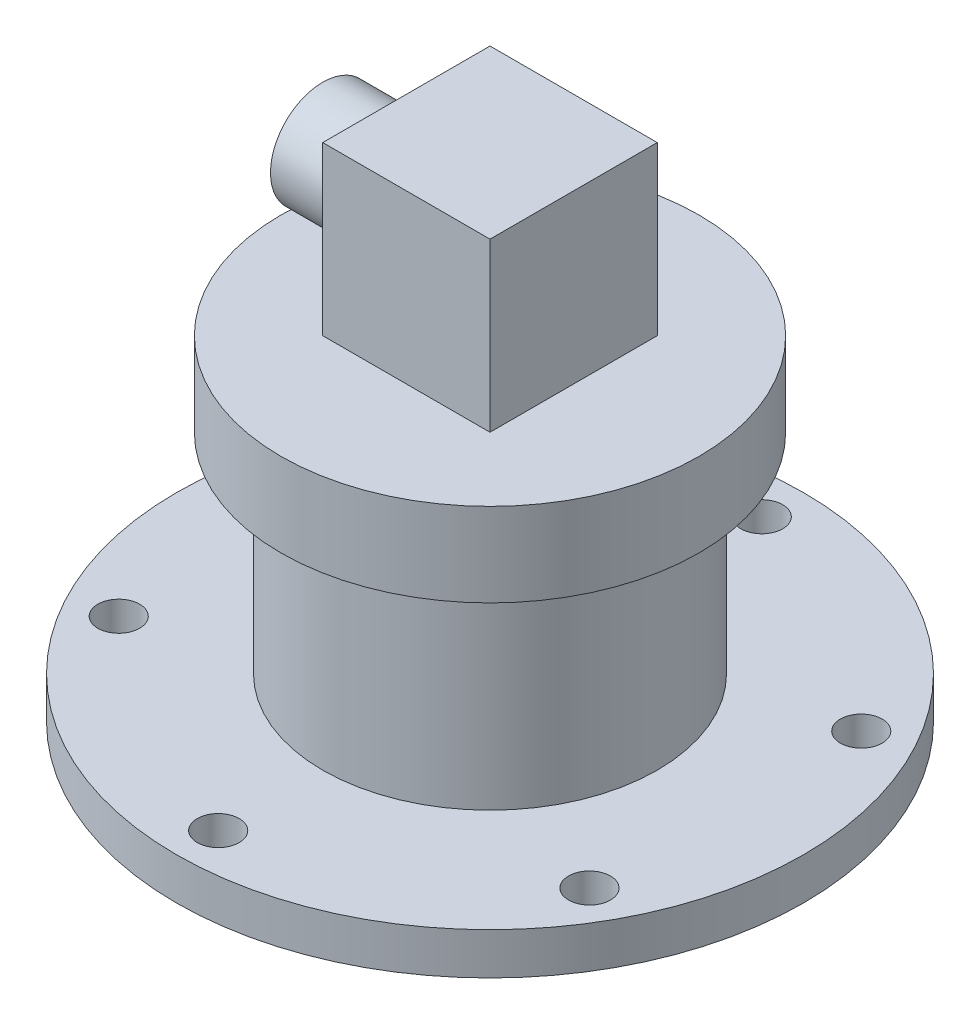
ISO-10303-21;
HEADER;
FILE_DESCRIPTION(('STEP AP214'),'2;1');
FILE_NAME('part.step','',(''),(''),'','','');
FILE_SCHEMA(('AUTOMOTIVE_DESIGN { 1 0 10303 214 1 1 1 1 }'));
ENDSEC;
DATA;
#1=APPLICATION_CONTEXT('core data for automotive mechanical design processes');
#2=APPLICATION_PROTOCOL_DEFINITION('international standard','automotive_design',2000,#1);
#3=PRODUCT_CONTEXT('',#1,'mechanical');
#4=PRODUCT('Part','Part','',(#3));
#5=PRODUCT_RELATED_PRODUCT_CATEGORY('part','',(#4));
#6=PRODUCT_DEFINITION_FORMATION('','',#4);
#7=PRODUCT_DEFINITION_CONTEXT('part definition',#1,'design');
#8=PRODUCT_DEFINITION('design','',#6,#7);
#9=PRODUCT_DEFINITION_SHAPE('','',#8);
#10=(LENGTH_UNIT() NAMED_UNIT(*) SI_UNIT(.MILLI.,.METRE.));
#11=(NAMED_UNIT(*) PLANE_ANGLE_UNIT() SI_UNIT($,.RADIAN.));
#12=(NAMED_UNIT(*) SI_UNIT($,.STERADIAN.) SOLID_ANGLE_UNIT());
#13=UNCERTAINTY_MEASURE_WITH_UNIT(LENGTH_MEASURE(1.E-05),#10,'distance_accuracy_value','');
#14=(GEOMETRIC_REPRESENTATION_CONTEXT(3) GLOBAL_UNCERTAINTY_ASSIGNED_CONTEXT((#13)) GLOBAL_UNIT_ASSIGNED_CONTEXT((#10,
#11,#12)) REPRESENTATION_CONTEXT('',''));
#15=CARTESIAN_POINT('',(0.,0.,0.));
#16=DIRECTION('',(0.,0.,1.));
#17=DIRECTION('',(1.,0.,0.));
#18=AXIS2_PLACEMENT_3D('',#15,#16,#17);
#19=CARTESIAN_POINT('',(0.,10.,0.));
#20=DIRECTION('',(0.,-1.,0.));
#21=DIRECTION('',(0.,0.,-1.));
#22=AXIS2_PLACEMENT_3D('',#19,#20,#21);
#23=CYLINDRICAL_SURFACE('',#22,75.);
#24=CARTESIAN_POINT('',(0.,10.,0.));
#25=DIRECTION('',(0.,1.,0.));
#26=DIRECTION('',(0.,0.,1.));
#27=AXIS2_PLACEMENT_3D('',#24,#25,#26);
#28=CIRCLE('',#27,75.);
#29=CARTESIAN_POINT('',(0.,10.,75.));
#30=VERTEX_POINT('',#29);
#31=EDGE_CURVE('E41',#30,#30,#28,.T.);
#32=ORIENTED_EDGE('',*,*,#31,.F.);
#33=EDGE_LOOP('',(#32));
#34=FACE_BOUND('',#33,.T.);
#35=CARTESIAN_POINT('',(0.,0.,0.));
#36=DIRECTION('',(0.,1.,0.));
#37=DIRECTION('',(0.,0.,1.));
#38=AXIS2_PLACEMENT_3D('',#35,#36,#37);
#39=CIRCLE('',#38,75.);
#40=CARTESIAN_POINT('',(0.,0.,75.));
#41=VERTEX_POINT('',#40);
#42=EDGE_CURVE('E115',#41,#41,#39,.T.);
#43=ORIENTED_EDGE('',*,*,#42,.T.);
#44=EDGE_LOOP('',(#43));
#45=FACE_BOUND('',#44,.T.);
#46=ADVANCED_FACE('F34',(#34,#45),#23,.T.);
#47=CARTESIAN_POINT('',(0.,10.,0.));
#48=DIRECTION('',(0.,1.,0.));
#49=DIRECTION('',(0.,0.,1.));
#50=AXIS2_PLACEMENT_3D('',#47,#48,#49);
#51=PLANE('',#50);
#52=CARTESIAN_POINT('',(0.,10.,0.));
#53=DIRECTION('',(0.,1.,0.));
#54=DIRECTION('',(0.,0.,1.));
#55=AXIS2_PLACEMENT_3D('',#52,#53,#54);
#56=CIRCLE('',#55,40.);
#57=CARTESIAN_POINT('',(0.,10.,40.));
#58=VERTEX_POINT('',#57);
#59=EDGE_CURVE('E104',#58,#58,#56,.T.);
#60=ORIENTED_EDGE('',*,*,#59,.F.);
#61=EDGE_LOOP('',(#60));
#62=FACE_BOUND('',#61,.T.);
#63=CARTESIAN_POINT('',(0.,10.,-65.));
#64=DIRECTION('',(0.,1.,0.));
#65=DIRECTION('',(0.,0.,1.));
#66=AXIS2_PLACEMENT_3D('',#63,#64,#65);
#67=CIRCLE('',#66,5.);
#68=CARTESIAN_POINT('',(0.,10.,-60.));
#69=VERTEX_POINT('',#68);
#70=EDGE_CURVE('E116',#69,#69,#67,.T.);
#71=ORIENTED_EDGE('',*,*,#70,.F.);
#72=EDGE_LOOP('',(#71));
#73=FACE_BOUND('',#72,.T.);
#74=CARTESIAN_POINT('',(-56.2916512459872,10.,-32.4999999999976));
#75=DIRECTION('',(0.,1.,0.));
#76=DIRECTION('',(0.,0.,1.));
#77=AXIS2_PLACEMENT_3D('',#74,#75,#76);
#78=CIRCLE('',#77,5.00000000000279);
#79=CARTESIAN_POINT('',(-56.2916512459872,10.,-27.4999999999948));
#80=VERTEX_POINT('',#79);
#81=EDGE_CURVE('E109',#80,#80,#78,.T.);
#82=ORIENTED_EDGE('',*,*,#81,.F.);
#83=EDGE_LOOP('',(#82));
#84=FACE_BOUND('',#83,.T.);
#85=CARTESIAN_POINT('',(-56.2916512459844,10.,32.5000000000024));
#86=DIRECTION('',(0.,1.,0.));
#87=DIRECTION('',(0.,0.,1.));
#88=AXIS2_PLACEMENT_3D('',#85,#86,#87);
#89=CIRCLE('',#88,5.00000000000526);
#90=CARTESIAN_POINT('',(-56.2916512459844,10.,37.5000000000077));
#91=VERTEX_POINT('',#90);
#92=EDGE_CURVE('E123',#91,#91,#89,.T.);
#93=ORIENTED_EDGE('',*,*,#92,.F.);
#94=EDGE_LOOP('',(#93));
#95=FACE_BOUND('',#94,.T.);
#96=CARTESIAN_POINT('',(5.51835272634541E-12,10.,65.));
#97=DIRECTION('',(0.,1.,0.));
#98=DIRECTION('',(0.,0.,1.));
#99=AXIS2_PLACEMENT_3D('',#96,#97,#98);
#100=CIRCLE('',#99,5.00000000000572);
#101=CARTESIAN_POINT('',(5.51835272634541E-12,10.,70.0000000000057));
#102=VERTEX_POINT('',#101);
#103=EDGE_CURVE('E140',#102,#102,#100,.T.);
#104=ORIENTED_EDGE('',*,*,#103,.F.);
#105=EDGE_LOOP('',(#104));
#106=FACE_BOUND('',#105,.T.);
#107=CARTESIAN_POINT('',(56.2916512459927,10.,32.4999999999976));
#108=DIRECTION('',(0.,1.,0.));
#109=DIRECTION('',(0.,0.,1.));
#110=AXIS2_PLACEMENT_3D('',#107,#108,#109);
#111=CIRCLE('',#110,5.00000000000356);
#112=CARTESIAN_POINT('',(56.2916512459927,10.,37.5000000000012));
#113=VERTEX_POINT('',#112);
#114=EDGE_CURVE('E134',#113,#113,#111,.T.);
#115=ORIENTED_EDGE('',*,*,#114,.F.);
#116=EDGE_LOOP('',(#115));
#117=FACE_BOUND('',#116,.T.);
#118=CARTESIAN_POINT('',(56.2916512459899,10.,-32.5000000000024));
#119=DIRECTION('',(0.,1.,0.));
#120=DIRECTION('',(0.,0.,1.));
#121=AXIS2_PLACEMENT_3D('',#118,#119,#120);
#122=CIRCLE('',#121,5.00000000000078);
#123=CARTESIAN_POINT('',(56.2916512459899,10.,-27.5000000000016));
#124=VERTEX_POINT('',#123);
#125=EDGE_CURVE('E128',#124,#124,#122,.T.);
#126=ORIENTED_EDGE('',*,*,#125,.F.);
#127=EDGE_LOOP('',(#126));
#128=FACE_BOUND('',#127,.T.);
#129=ORIENTED_EDGE('',*,*,#31,.T.);
#130=EDGE_LOOP('',(#129));
#131=FACE_BOUND('',#130,.T.);
#132=ADVANCED_FACE('F156',(#62,#73,#84,#95,#106,#117,#128,#131),#51,.T.);
#133=CARTESIAN_POINT('',(0.,0.,0.));
#134=DIRECTION('',(0.,1.,0.));
#135=DIRECTION('',(0.,0.,1.));
#136=AXIS2_PLACEMENT_3D('',#133,#134,#135);
#137=PLANE('',#136);
#138=CARTESIAN_POINT('',(0.,0.,-65.));
#139=DIRECTION('',(0.,1.,0.));
#140=DIRECTION('',(0.,0.,1.));
#141=AXIS2_PLACEMENT_3D('',#138,#139,#140);
#142=CIRCLE('',#141,5.);
#143=CARTESIAN_POINT('',(0.,0.,-60.));
#144=VERTEX_POINT('',#143);
#145=EDGE_CURVE('E112',#144,#144,#142,.T.);
#146=ORIENTED_EDGE('',*,*,#145,.T.);
#147=EDGE_LOOP('',(#146));
#148=FACE_BOUND('',#147,.T.);
#149=CARTESIAN_POINT('',(-56.2916512459872,0.,-32.4999999999976));
#150=DIRECTION('',(0.,1.,0.));
#151=DIRECTION('',(0.,0.,1.));
#152=AXIS2_PLACEMENT_3D('',#149,#150,#151);
#153=CIRCLE('',#152,5.00000000000279);
#154=CARTESIAN_POINT('',(-56.2916512459872,0.,-27.4999999999948));
#155=VERTEX_POINT('',#154);
#156=EDGE_CURVE('E120',#155,#155,#153,.T.);
#157=ORIENTED_EDGE('',*,*,#156,.T.);
#158=EDGE_LOOP('',(#157));
#159=FACE_BOUND('',#158,.T.);
#160=CARTESIAN_POINT('',(-56.2916512459844,0.,32.5000000000024));
#161=DIRECTION('',(0.,1.,0.));
#162=DIRECTION('',(0.,0.,1.));
#163=AXIS2_PLACEMENT_3D('',#160,#161,#162);
#164=CIRCLE('',#163,5.00000000000526);
#165=CARTESIAN_POINT('',(-56.2916512459844,0.,37.5000000000077));
#166=VERTEX_POINT('',#165);
#167=EDGE_CURVE('E143',#166,#166,#164,.T.);
#168=ORIENTED_EDGE('',*,*,#167,.T.);
#169=EDGE_LOOP('',(#168));
#170=FACE_BOUND('',#169,.T.);
#171=CARTESIAN_POINT('',(5.51835272634541E-12,0.,65.));
#172=DIRECTION('',(0.,1.,0.));
#173=DIRECTION('',(0.,0.,1.));
#174=AXIS2_PLACEMENT_3D('',#171,#172,#173);
#175=CIRCLE('',#174,5.00000000000572);
#176=CARTESIAN_POINT('',(5.51835272634541E-12,0.,70.0000000000057));
#177=VERTEX_POINT('',#176);
#178=EDGE_CURVE('E137',#177,#177,#175,.T.);
#179=ORIENTED_EDGE('',*,*,#178,.T.);
#180=EDGE_LOOP('',(#179));
#181=FACE_BOUND('',#180,.T.);
#182=CARTESIAN_POINT('',(56.2916512459927,0.,32.4999999999976));
#183=DIRECTION('',(0.,1.,0.));
#184=DIRECTION('',(0.,0.,1.));
#185=AXIS2_PLACEMENT_3D('',#182,#183,#184);
#186=CIRCLE('',#185,5.00000000000356);
#187=CARTESIAN_POINT('',(56.2916512459927,0.,37.5000000000012));
#188=VERTEX_POINT('',#187);
#189=EDGE_CURVE('E131',#188,#188,#186,.T.);
#190=ORIENTED_EDGE('',*,*,#189,.T.);
#191=EDGE_LOOP('',(#190));
#192=FACE_BOUND('',#191,.T.);
#193=CARTESIAN_POINT('',(56.2916512459899,0.,-32.5000000000024));
#194=DIRECTION('',(0.,1.,0.));
#195=DIRECTION('',(0.,0.,1.));
#196=AXIS2_PLACEMENT_3D('',#193,#194,#195);
#197=CIRCLE('',#196,5.00000000000078);
#198=CARTESIAN_POINT('',(56.2916512459899,0.,-27.5000000000016));
#199=VERTEX_POINT('',#198);
#200=EDGE_CURVE('E119',#199,#199,#197,.T.);
#201=ORIENTED_EDGE('',*,*,#200,.T.);
#202=EDGE_LOOP('',(#201));
#203=FACE_BOUND('',#202,.T.);
#204=ORIENTED_EDGE('',*,*,#42,.F.);
#205=EDGE_LOOP('',(#204));
#206=FACE_BOUND('',#205,.T.);
#207=ADVANCED_FACE('F153',(#148,#159,#170,#181,#192,#203,#206),#137,.F.);
#208=CARTESIAN_POINT('',(56.2916512459899,0.,-32.5000000000024));
#209=DIRECTION('',(0.,1.,0.));
#210=DIRECTION('',(0.,0.,1.));
#211=AXIS2_PLACEMENT_3D('',#208,#209,#210);
#212=CYLINDRICAL_SURFACE('',#211,5.00000000000078);
#213=ORIENTED_EDGE('',*,*,#200,.F.);
#214=EDGE_LOOP('',(#213));
#215=FACE_BOUND('',#214,.T.);
#216=ORIENTED_EDGE('',*,*,#125,.T.);
#217=EDGE_LOOP('',(#216));
#218=FACE_BOUND('',#217,.T.);
#219=ADVANCED_FACE('F155',(#215,#218),#212,.F.);
#220=CARTESIAN_POINT('',(56.2916512459927,0.,32.4999999999976));
#221=DIRECTION('',(0.,1.,0.));
#222=DIRECTION('',(0.,0.,1.));
#223=AXIS2_PLACEMENT_3D('',#220,#221,#222);
#224=CYLINDRICAL_SURFACE('',#223,5.00000000000356);
#225=ORIENTED_EDGE('',*,*,#189,.F.);
#226=EDGE_LOOP('',(#225));
#227=FACE_BOUND('',#226,.T.);
#228=ORIENTED_EDGE('',*,*,#114,.T.);
#229=EDGE_LOOP('',(#228));
#230=FACE_BOUND('',#229,.T.);
#231=ADVANCED_FACE('F162',(#227,#230),#224,.F.);
#232=CARTESIAN_POINT('',(5.51835272634541E-12,0.,65.));
#233=DIRECTION('',(0.,1.,0.));
#234=DIRECTION('',(0.,0.,1.));
#235=AXIS2_PLACEMENT_3D('',#232,#233,#234);
#236=CYLINDRICAL_SURFACE('',#235,5.00000000000572);
#237=ORIENTED_EDGE('',*,*,#178,.F.);
#238=EDGE_LOOP('',(#237));
#239=FACE_BOUND('',#238,.T.);
#240=ORIENTED_EDGE('',*,*,#103,.T.);
#241=EDGE_LOOP('',(#240));
#242=FACE_BOUND('',#241,.T.);
#243=ADVANCED_FACE('F323',(#239,#242),#236,.F.);
#244=CARTESIAN_POINT('',(-56.2916512459844,0.,32.5000000000024));
#245=DIRECTION('',(0.,1.,0.));
#246=DIRECTION('',(0.,0.,1.));
#247=AXIS2_PLACEMENT_3D('',#244,#245,#246);
#248=CYLINDRICAL_SURFACE('',#247,5.00000000000526);
#249=ORIENTED_EDGE('',*,*,#167,.F.);
#250=EDGE_LOOP('',(#249));
#251=FACE_BOUND('',#250,.T.);
#252=ORIENTED_EDGE('',*,*,#92,.T.);
#253=EDGE_LOOP('',(#252));
#254=FACE_BOUND('',#253,.T.);
#255=ADVANCED_FACE('F318',(#251,#254),#248,.F.);
#256=CARTESIAN_POINT('',(-56.2916512459872,0.,-32.4999999999976));
#257=DIRECTION('',(0.,1.,0.));
#258=DIRECTION('',(0.,0.,1.));
#259=AXIS2_PLACEMENT_3D('',#256,#257,#258);
#260=CYLINDRICAL_SURFACE('',#259,5.00000000000279);
#261=ORIENTED_EDGE('',*,*,#156,.F.);
#262=EDGE_LOOP('',(#261));
#263=FACE_BOUND('',#262,.T.);
#264=ORIENTED_EDGE('',*,*,#81,.T.);
#265=EDGE_LOOP('',(#264));
#266=FACE_BOUND('',#265,.T.);
#267=ADVANCED_FACE('F315',(#263,#266),#260,.F.);
#268=CARTESIAN_POINT('',(0.,0.,-65.));
#269=DIRECTION('',(0.,1.,0.));
#270=DIRECTION('',(0.,0.,1.));
#271=AXIS2_PLACEMENT_3D('',#268,#269,#270);
#272=CYLINDRICAL_SURFACE('',#271,5.);
#273=ORIENTED_EDGE('',*,*,#145,.F.);
#274=EDGE_LOOP('',(#273));
#275=FACE_BOUND('',#274,.T.);
#276=ORIENTED_EDGE('',*,*,#70,.T.);
#277=EDGE_LOOP('',(#276));
#278=FACE_BOUND('',#277,.T.);
#279=ADVANCED_FACE('F185',(#275,#278),#272,.F.);
#280=CARTESIAN_POINT('',(0.,60.,0.));
#281=DIRECTION('',(0.,-1.,0.));
#282=DIRECTION('',(0.,0.,-1.));
#283=AXIS2_PLACEMENT_3D('',#280,#281,#282);
#284=CYLINDRICAL_SURFACE('',#283,40.);
#285=CARTESIAN_POINT('',(0.,60.,0.));
#286=DIRECTION('',(0.,1.,0.));
#287=DIRECTION('',(0.,0.,1.));
#288=AXIS2_PLACEMENT_3D('',#285,#286,#287);
#289=CIRCLE('',#288,40.);
#290=CARTESIAN_POINT('',(0.,60.,40.));
#291=VERTEX_POINT('',#290);
#292=EDGE_CURVE('E106',#291,#291,#289,.T.);
#293=ORIENTED_EDGE('',*,*,#292,.F.);
#294=EDGE_LOOP('',(#293));
#295=FACE_BOUND('',#294,.T.);
#296=ORIENTED_EDGE('',*,*,#59,.T.);
#297=EDGE_LOOP('',(#296));
#298=FACE_BOUND('',#297,.T.);
#299=ADVANCED_FACE('F190',(#295,#298),#284,.T.);
#300=CARTESIAN_POINT('',(0.,80.,0.));
#301=DIRECTION('',(0.,-1.,0.));
#302=DIRECTION('',(0.,0.,-1.));
#303=AXIS2_PLACEMENT_3D('',#300,#301,#302);
#304=CYLINDRICAL_SURFACE('',#303,50.);
#305=CARTESIAN_POINT('',(0.,80.,0.));
#306=DIRECTION('',(0.,1.,0.));
#307=DIRECTION('',(0.,0.,1.));
#308=AXIS2_PLACEMENT_3D('',#305,#306,#307);
#309=CIRCLE('',#308,50.);
#310=CARTESIAN_POINT('',(0.,80.,50.));
#311=VERTEX_POINT('',#310);
#312=EDGE_CURVE('E97',#311,#311,#309,.T.);
#313=ORIENTED_EDGE('',*,*,#312,.F.);
#314=EDGE_LOOP('',(#313));
#315=FACE_BOUND('',#314,.T.);
#316=CARTESIAN_POINT('',(0.,60.,0.));
#317=DIRECTION('',(0.,1.,0.));
#318=DIRECTION('',(0.,0.,1.));
#319=AXIS2_PLACEMENT_3D('',#316,#317,#318);
#320=CIRCLE('',#319,50.);
#321=CARTESIAN_POINT('',(0.,60.,50.));
#322=VERTEX_POINT('',#321);
#323=EDGE_CURVE('E94',#322,#322,#320,.T.);
#324=ORIENTED_EDGE('',*,*,#323,.T.);
#325=EDGE_LOOP('',(#324));
#326=FACE_BOUND('',#325,.T.);
#327=ADVANCED_FACE('F195',(#315,#326),#304,.T.);
#328=CARTESIAN_POINT('',(0.,80.,0.));
#329=DIRECTION('',(0.,1.,0.));
#330=DIRECTION('',(0.,0.,1.));
#331=AXIS2_PLACEMENT_3D('',#328,#329,#330);
#332=PLANE('',#331);
#333=DIRECTION('',(0.,0.,-1.));
#334=VECTOR('',#333,1.);
#335=CARTESIAN_POINT('',(20.,80.,-20.));
#336=LINE('',#335,#334);
#337=CARTESIAN_POINT('',(20.,80.,20.));
#338=VERTEX_POINT('',#337);
#339=CARTESIAN_POINT('',(20.,80.,-20.));
#340=VERTEX_POINT('',#339);
#341=EDGE_CURVE('E48',#338,#340,#336,.T.);
#342=ORIENTED_EDGE('',*,*,#341,.F.);
#343=DIRECTION('',(1.,0.,0.));
#344=VECTOR('',#343,1.);
#345=CARTESIAN_POINT('',(-20.,80.,20.));
#346=LINE('',#345,#344);
#347=CARTESIAN_POINT('',(-20.,80.,20.));
#348=VERTEX_POINT('',#347);
#349=EDGE_CURVE('E52',#348,#338,#346,.T.);
#350=ORIENTED_EDGE('',*,*,#349,.F.);
#351=DIRECTION('',(0.,0.,1.));
#352=VECTOR('',#351,1.);
#353=CARTESIAN_POINT('',(-20.,80.,-20.));
#354=LINE('',#353,#352);
#355=CARTESIAN_POINT('',(-20.,80.,-20.));
#356=VERTEX_POINT('',#355);
#357=EDGE_CURVE('E409',#356,#348,#354,.T.);
#358=ORIENTED_EDGE('',*,*,#357,.F.);
#359=DIRECTION('',(-1.,0.,0.));
#360=VECTOR('',#359,1.);
#361=CARTESIAN_POINT('',(-20.,80.,-20.));
#362=LINE('',#361,#360);
#363=EDGE_CURVE('E407',#340,#356,#362,.T.);
#364=ORIENTED_EDGE('',*,*,#363,.F.);
#365=EDGE_LOOP('',(#342,#350,#358,#364));
#366=FACE_BOUND('',#365,.T.);
#367=ORIENTED_EDGE('',*,*,#312,.T.);
#368=EDGE_LOOP('',(#367));
#369=FACE_BOUND('',#368,.T.);
#370=ADVANCED_FACE('F205',(#366,#369),#332,.T.);
#371=CARTESIAN_POINT('',(0.,60.,0.));
#372=DIRECTION('',(0.,1.,0.));
#373=DIRECTION('',(0.,0.,1.));
#374=AXIS2_PLACEMENT_3D('',#371,#372,#373);
#375=PLANE('',#374);
#376=ORIENTED_EDGE('',*,*,#292,.T.);
#377=EDGE_LOOP('',(#376));
#378=FACE_BOUND('',#377,.T.);
#379=ORIENTED_EDGE('',*,*,#323,.F.);
#380=EDGE_LOOP('',(#379));
#381=FACE_BOUND('',#380,.T.);
#382=ADVANCED_FACE('F213',(#378,#381),#375,.F.);
#383=CARTESIAN_POINT('',(20.,120.,-20.));
#384=DIRECTION('',(-1.,0.,0.));
#385=DIRECTION('',(0.,0.,1.));
#386=AXIS2_PLACEMENT_3D('',#383,#384,#385);
#387=PLANE('',#386);
#388=ORIENTED_EDGE('',*,*,#341,.T.);
#389=DIRECTION('',(0.,-1.,0.));
#390=VECTOR('',#389,1.);
#391=CARTESIAN_POINT('',(20.,120.,-20.));
#392=LINE('',#391,#390);
#393=CARTESIAN_POINT('',(20.,120.,-20.));
#394=VERTEX_POINT('',#393);
#395=EDGE_CURVE('E77',#394,#340,#392,.T.);
#396=ORIENTED_EDGE('',*,*,#395,.F.);
#397=DIRECTION('',(0.,0.,-1.));
#398=VECTOR('',#397,1.);
#399=CARTESIAN_POINT('',(20.,120.,-20.));
#400=LINE('',#399,#398);
#401=CARTESIAN_POINT('',(20.,120.,20.));
#402=VERTEX_POINT('',#401);
#403=EDGE_CURVE('E83',#402,#394,#400,.T.);
#404=ORIENTED_EDGE('',*,*,#403,.F.);
#405=DIRECTION('',(0.,-1.,0.));
#406=VECTOR('',#405,1.);
#407=CARTESIAN_POINT('',(20.,120.,20.));
#408=LINE('',#407,#406);
#409=EDGE_CURVE('E405',#402,#338,#408,.T.);
#410=ORIENTED_EDGE('',*,*,#409,.T.);
#411=EDGE_LOOP('',(#388,#396,#404,#410));
#412=FACE_BOUND('',#411,.T.);
#413=ADVANCED_FACE('F93',(#412),#387,.F.);
#414=CARTESIAN_POINT('',(-20.,120.,-20.));
#415=DIRECTION('',(0.,0.,1.));
#416=DIRECTION('',(1.,0.,0.));
#417=AXIS2_PLACEMENT_3D('',#414,#415,#416);
#418=PLANE('',#417);
#419=ORIENTED_EDGE('',*,*,#363,.T.);
#420=DIRECTION('',(0.,-1.,0.));
#421=VECTOR('',#420,1.);
#422=CARTESIAN_POINT('',(-20.,120.,-20.));
#423=LINE('',#422,#421);
#424=CARTESIAN_POINT('',(-20.,120.,-20.));
#425=VERTEX_POINT('',#424);
#426=EDGE_CURVE('E79',#425,#356,#423,.T.);
#427=ORIENTED_EDGE('',*,*,#426,.F.);
#428=DIRECTION('',(-1.,0.,0.));
#429=VECTOR('',#428,1.);
#430=CARTESIAN_POINT('',(-20.,120.,-20.));
#431=LINE('',#430,#429);
#432=EDGE_CURVE('E72',#394,#425,#431,.T.);
#433=ORIENTED_EDGE('',*,*,#432,.F.);
#434=ORIENTED_EDGE('',*,*,#395,.T.);
#435=EDGE_LOOP('',(#419,#427,#433,#434));
#436=FACE_BOUND('',#435,.T.);
#437=ADVANCED_FACE('F75',(#436),#418,.F.);
#438=CARTESIAN_POINT('',(-20.,120.,-20.));
#439=DIRECTION('',(1.,0.,0.));
#440=DIRECTION('',(0.,0.,-1.));
#441=AXIS2_PLACEMENT_3D('',#438,#439,#440);
#442=PLANE('',#441);
#443=CARTESIAN_POINT('',(-20.,100.,0.));
#444=DIRECTION('',(1.,0.,0.));
#445=DIRECTION('',(0.,0.,-1.));
#446=AXIS2_PLACEMENT_3D('',#443,#444,#445);
#447=CIRCLE('',#446,12.5);
#448=CARTESIAN_POINT('',(-20.,100.,-12.5));
#449=VERTEX_POINT('',#448);
#450=EDGE_CURVE('E11',#449,#449,#447,.F.);
#451=ORIENTED_EDGE('',*,*,#450,.F.);
#452=EDGE_LOOP('',(#451));
#453=FACE_BOUND('',#452,.T.);
#454=ORIENTED_EDGE('',*,*,#357,.T.);
#455=DIRECTION('',(0.,-1.,0.));
#456=VECTOR('',#455,1.);
#457=CARTESIAN_POINT('',(-20.,120.,20.));
#458=LINE('',#457,#456);
#459=CARTESIAN_POINT('',(-20.,120.,20.));
#460=VERTEX_POINT('',#459);
#461=EDGE_CURVE('E99',#460,#348,#458,.T.);
#462=ORIENTED_EDGE('',*,*,#461,.F.);
#463=DIRECTION('',(0.,0.,1.));
#464=VECTOR('',#463,1.);
#465=CARTESIAN_POINT('',(-20.,120.,-20.));
#466=LINE('',#465,#464);
#467=EDGE_CURVE('E82',#425,#460,#466,.T.);
#468=ORIENTED_EDGE('',*,*,#467,.F.);
#469=ORIENTED_EDGE('',*,*,#426,.T.);
#470=EDGE_LOOP('',(#454,#462,#468,#469));
#471=FACE_BOUND('',#470,.T.);
#472=ADVANCED_FACE('F241',(#453,#471),#442,.F.);
#473=CARTESIAN_POINT('',(-20.,120.,20.));
#474=DIRECTION('',(0.,0.,-1.));
#475=DIRECTION('',(-1.,0.,0.));
#476=AXIS2_PLACEMENT_3D('',#473,#474,#475);
#477=PLANE('',#476);
#478=ORIENTED_EDGE('',*,*,#349,.T.);
#479=ORIENTED_EDGE('',*,*,#409,.F.);
#480=DIRECTION('',(1.,0.,0.));
#481=VECTOR('',#480,1.);
#482=CARTESIAN_POINT('',(-20.,120.,20.));
#483=LINE('',#482,#481);
#484=EDGE_CURVE('E88',#460,#402,#483,.T.);
#485=ORIENTED_EDGE('',*,*,#484,.F.);
#486=ORIENTED_EDGE('',*,*,#461,.T.);
#487=EDGE_LOOP('',(#478,#479,#485,#486));
#488=FACE_BOUND('',#487,.T.);
#489=ADVANCED_FACE('F248',(#488),#477,.F.);
#490=CARTESIAN_POINT('',(0.,120.,0.));
#491=DIRECTION('',(0.,1.,0.));
#492=DIRECTION('',(0.,0.,1.));
#493=AXIS2_PLACEMENT_3D('',#490,#491,#492);
#494=PLANE('',#493);
#495=ORIENTED_EDGE('',*,*,#403,.T.);
#496=ORIENTED_EDGE('',*,*,#432,.T.);
#497=ORIENTED_EDGE('',*,*,#467,.T.);
#498=ORIENTED_EDGE('',*,*,#484,.T.);
#499=EDGE_LOOP('',(#495,#496,#497,#498));
#500=FACE_BOUND('',#499,.T.);
#501=ADVANCED_FACE('F86',(#500),#494,.T.);
#502=CARTESIAN_POINT('',(-40.,100.,0.));
#503=DIRECTION('',(1.,0.,0.));
#504=DIRECTION('',(0.,0.,-1.));
#505=AXIS2_PLACEMENT_3D('',#502,#503,#504);
#506=CYLINDRICAL_SURFACE('',#505,12.5);
#507=CARTESIAN_POINT('',(-40.,100.,0.));
#508=DIRECTION('',(-1.,0.,0.));
#509=DIRECTION('',(0.,0.,1.));
#510=AXIS2_PLACEMENT_3D('',#507,#508,#509);
#511=CIRCLE('',#510,12.5);
#512=CARTESIAN_POINT('',(-40.,100.,12.5));
#513=VERTEX_POINT('',#512);
#514=EDGE_CURVE('E395',#513,#513,#511,.T.);
#515=ORIENTED_EDGE('',*,*,#514,.F.);
#516=EDGE_LOOP('',(#515));
#517=FACE_BOUND('',#516,.T.);
#518=ORIENTED_EDGE('',*,*,#450,.T.);
#519=EDGE_LOOP('',(#518));
#520=FACE_BOUND('',#519,.T.);
#521=ADVANCED_FACE('F262',(#517,#520),#506,.T.);
#522=CARTESIAN_POINT('',(-40.,100.,0.));
#523=DIRECTION('',(-1.,0.,0.));
#524=DIRECTION('',(0.,0.,1.));
#525=AXIS2_PLACEMENT_3D('',#522,#523,#524);
#526=PLANE('',#525);
#527=CARTESIAN_POINT('',(-40.,100.,0.));
#528=DIRECTION('',(-1.,0.,0.));
#529=DIRECTION('',(0.,0.,1.));
#530=AXIS2_PLACEMENT_3D('',#527,#528,#529);
#531=CIRCLE('',#530,7.5);
#532=CARTESIAN_POINT('',(-40.,100.,7.50000000000001));
#533=VERTEX_POINT('',#532);
#534=EDGE_CURVE('E396',#533,#533,#531,.T.);
#535=ORIENTED_EDGE('',*,*,#534,.F.);
#536=EDGE_LOOP('',(#535));
#537=FACE_BOUND('',#536,.T.);
#538=ORIENTED_EDGE('',*,*,#514,.T.);
#539=EDGE_LOOP('',(#538));
#540=FACE_BOUND('',#539,.T.);
#541=ADVANCED_FACE('F278',(#537,#540),#526,.T.);
#542=CARTESIAN_POINT('',(-25.,100.,0.));
#543=DIRECTION('',(-1.,0.,0.));
#544=DIRECTION('',(0.,0.,1.));
#545=AXIS2_PLACEMENT_3D('',#542,#543,#544);
#546=CYLINDRICAL_SURFACE('',#545,7.5);
#547=CARTESIAN_POINT('',(-25.,100.,0.));
#548=DIRECTION('',(-1.,0.,0.));
#549=DIRECTION('',(0.,0.,1.));
#550=AXIS2_PLACEMENT_3D('',#547,#548,#549);
#551=CIRCLE('',#550,7.5);
#552=CARTESIAN_POINT('',(-25.,100.,7.5));
#553=VERTEX_POINT('',#552);
#554=EDGE_CURVE('E394',#553,#553,#551,.T.);
#555=ORIENTED_EDGE('',*,*,#554,.F.);
#556=EDGE_LOOP('',(#555));
#557=FACE_BOUND('',#556,.T.);
#558=ORIENTED_EDGE('',*,*,#534,.T.);
#559=EDGE_LOOP('',(#558));
#560=FACE_BOUND('',#559,.T.);
#561=ADVANCED_FACE('F288',(#557,#560),#546,.F.);
#562=CARTESIAN_POINT('',(-25.,100.,0.));
#563=DIRECTION('',(-1.,0.,0.));
#564=DIRECTION('',(0.,0.,1.));
#565=AXIS2_PLACEMENT_3D('',#562,#563,#564);
#566=PLANE('',#565);
#567=ORIENTED_EDGE('',*,*,#554,.T.);
#568=EDGE_LOOP('',(#567));
#569=FACE_BOUND('',#568,.T.);
#570=ADVANCED_FACE('F298',(#569),#566,.T.);
#571=CLOSED_SHELL('',(#46,#132,#207,#219,#231,#243,#255,#267,#279,#299,#327,#370,#382,#413,#437,
#472,#489,#501,#521,#541,#561,#570));
#572=MANIFOLD_SOLID_BREP('B2',#571);
#573=ADVANCED_BREP_SHAPE_REPRESENTATION('',(#18,#572),#14);
#574=SHAPE_DEFINITION_REPRESENTATION(#9,#573);
ENDSEC;
END-ISO-10303-21;
